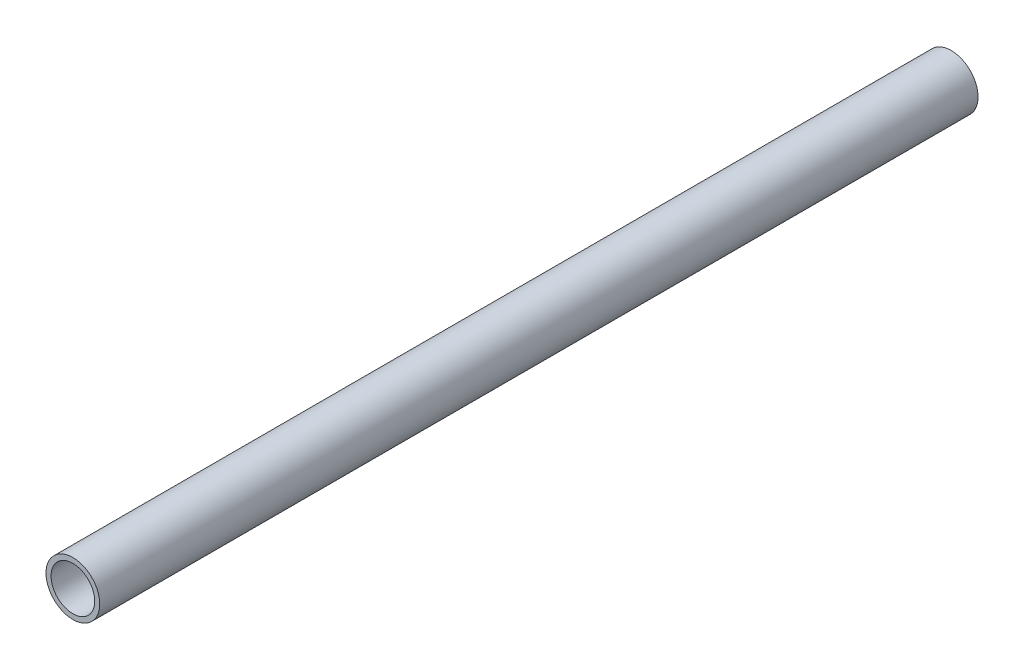
ISO-10303-21;
HEADER;
FILE_DESCRIPTION(('STEP AP214'),'2;1');
FILE_NAME('part.step','',(''),(''),'','','');
FILE_SCHEMA(('AUTOMOTIVE_DESIGN { 1 0 10303 214 1 1 1 1 }'));
ENDSEC;
DATA;
#1=APPLICATION_CONTEXT('core data for automotive mechanical design processes');
#2=APPLICATION_PROTOCOL_DEFINITION('international standard','automotive_design',2000,#1);
#3=PRODUCT_CONTEXT('',#1,'mechanical');
#4=PRODUCT('Part','Part','',(#3));
#5=PRODUCT_RELATED_PRODUCT_CATEGORY('part','',(#4));
#6=PRODUCT_DEFINITION_FORMATION('','',#4);
#7=PRODUCT_DEFINITION_CONTEXT('part definition',#1,'design');
#8=PRODUCT_DEFINITION('design','',#6,#7);
#9=PRODUCT_DEFINITION_SHAPE('','',#8);
#10=(LENGTH_UNIT() NAMED_UNIT(*) SI_UNIT(.MILLI.,.METRE.));
#11=(NAMED_UNIT(*) PLANE_ANGLE_UNIT() SI_UNIT($,.RADIAN.));
#12=(NAMED_UNIT(*) SI_UNIT($,.STERADIAN.) SOLID_ANGLE_UNIT());
#13=UNCERTAINTY_MEASURE_WITH_UNIT(LENGTH_MEASURE(1.E-05),#10,'distance_accuracy_value','');
#14=(GEOMETRIC_REPRESENTATION_CONTEXT(3) GLOBAL_UNCERTAINTY_ASSIGNED_CONTEXT((#13)) GLOBAL_UNIT_ASSIGNED_CONTEXT((#10,
#11,#12)) REPRESENTATION_CONTEXT('',''));
#15=CARTESIAN_POINT('',(0.,0.,0.));
#16=DIRECTION('',(0.,0.,1.));
#17=DIRECTION('',(1.,0.,0.));
#18=AXIS2_PLACEMENT_3D('',#15,#16,#17);
#19=CARTESIAN_POINT('',(0.,0.,259.));
#20=DIRECTION('',(0.,0.,-1.));
#21=DIRECTION('',(-1.,0.,0.));
#22=AXIS2_PLACEMENT_3D('',#19,#20,#21);
#23=CYLINDRICAL_SURFACE('',#22,16.);
#24=CARTESIAN_POINT('',(0.,0.,259.));
#25=DIRECTION('',(0.,0.,1.));
#26=DIRECTION('',(1.,0.,0.));
#27=AXIS2_PLACEMENT_3D('',#24,#25,#26);
#28=CIRCLE('',#27,16.);
#29=CARTESIAN_POINT('',(16.,0.,259.));
#30=VERTEX_POINT('',#29);
#31=EDGE_CURVE('E10',#30,#30,#28,.T.);
#32=ORIENTED_EDGE('',*,*,#31,.F.);
#33=EDGE_LOOP('',(#32));
#34=FACE_BOUND('',#33,.T.);
#35=CARTESIAN_POINT('',(0.,0.,-264.));
#36=DIRECTION('',(0.,0.,-1.));
#37=DIRECTION('',(-1.,0.,0.));
#38=AXIS2_PLACEMENT_3D('',#35,#36,#37);
#39=CIRCLE('',#38,16.);
#40=CARTESIAN_POINT('',(-16.,0.,-264.));
#41=VERTEX_POINT('',#40);
#42=EDGE_CURVE('E48',#41,#41,#39,.T.);
#43=ORIENTED_EDGE('',*,*,#42,.F.);
#44=EDGE_LOOP('',(#43));
#45=FACE_BOUND('',#44,.T.);
#46=ADVANCED_FACE('F33',(#34,#45),#23,.T.);
#47=CARTESIAN_POINT('',(0.,0.,259.));
#48=DIRECTION('',(0.,0.,1.));
#49=DIRECTION('',(1.,0.,0.));
#50=AXIS2_PLACEMENT_3D('',#47,#48,#49);
#51=PLANE('',#50);
#52=CARTESIAN_POINT('',(0.,0.,259.));
#53=DIRECTION('',(0.,0.,1.));
#54=DIRECTION('',(1.,0.,0.));
#55=AXIS2_PLACEMENT_3D('',#52,#53,#54);
#56=CIRCLE('',#55,13.);
#57=CARTESIAN_POINT('',(13.,0.,259.));
#58=VERTEX_POINT('',#57);
#59=EDGE_CURVE('E39',#58,#58,#56,.T.);
#60=ORIENTED_EDGE('',*,*,#59,.F.);
#61=EDGE_LOOP('',(#60));
#62=FACE_BOUND('',#61,.T.);
#63=ORIENTED_EDGE('',*,*,#31,.T.);
#64=EDGE_LOOP('',(#63));
#65=FACE_BOUND('',#64,.T.);
#66=ADVANCED_FACE('F56',(#62,#65),#51,.T.);
#67=CARTESIAN_POINT('',(0.,0.,259.));
#68=DIRECTION('',(0.,0.,-1.));
#69=DIRECTION('',(-1.,0.,0.));
#70=AXIS2_PLACEMENT_3D('',#67,#68,#69);
#71=CYLINDRICAL_SURFACE('',#70,13.);
#72=ORIENTED_EDGE('',*,*,#59,.T.);
#73=EDGE_LOOP('',(#72));
#74=FACE_BOUND('',#73,.T.);
#75=CARTESIAN_POINT('',(0.,0.,-259.));
#76=DIRECTION('',(0.,0.,1.));
#77=DIRECTION('',(1.,0.,0.));
#78=AXIS2_PLACEMENT_3D('',#75,#76,#77);
#79=CIRCLE('',#78,13.);
#80=CARTESIAN_POINT('',(13.,0.,-259.));
#81=VERTEX_POINT('',#80);
#82=EDGE_CURVE('E43',#81,#81,#79,.T.);
#83=ORIENTED_EDGE('',*,*,#82,.F.);
#84=EDGE_LOOP('',(#83));
#85=FACE_BOUND('',#84,.T.);
#86=ADVANCED_FACE('F61',(#74,#85),#71,.F.);
#87=CARTESIAN_POINT('',(0.,0.,-259.));
#88=DIRECTION('',(0.,0.,-1.));
#89=DIRECTION('',(-1.,0.,0.));
#90=AXIS2_PLACEMENT_3D('',#87,#88,#89);
#91=PLANE('',#90);
#92=ORIENTED_EDGE('',*,*,#82,.T.);
#93=EDGE_LOOP('',(#92));
#94=FACE_BOUND('',#93,.T.);
#95=ADVANCED_FACE('F66',(#94),#91,.F.);
#96=CARTESIAN_POINT('',(0.,0.,-264.));
#97=DIRECTION('',(0.,0.,-1.));
#98=DIRECTION('',(-1.,0.,0.));
#99=AXIS2_PLACEMENT_3D('',#96,#97,#98);
#100=PLANE('',#99);
#101=ORIENTED_EDGE('',*,*,#42,.T.);
#102=EDGE_LOOP('',(#101));
#103=FACE_BOUND('',#102,.T.);
#104=ADVANCED_FACE('F53',(#103),#100,.T.);
#105=CLOSED_SHELL('',(#46,#66,#86,#95,#104));
#106=MANIFOLD_SOLID_BREP('B2',#105);
#107=ADVANCED_BREP_SHAPE_REPRESENTATION('',(#18,#106),#14);
#108=SHAPE_DEFINITION_REPRESENTATION(#9,#107);
ENDSEC;
END-ISO-10303-21;
